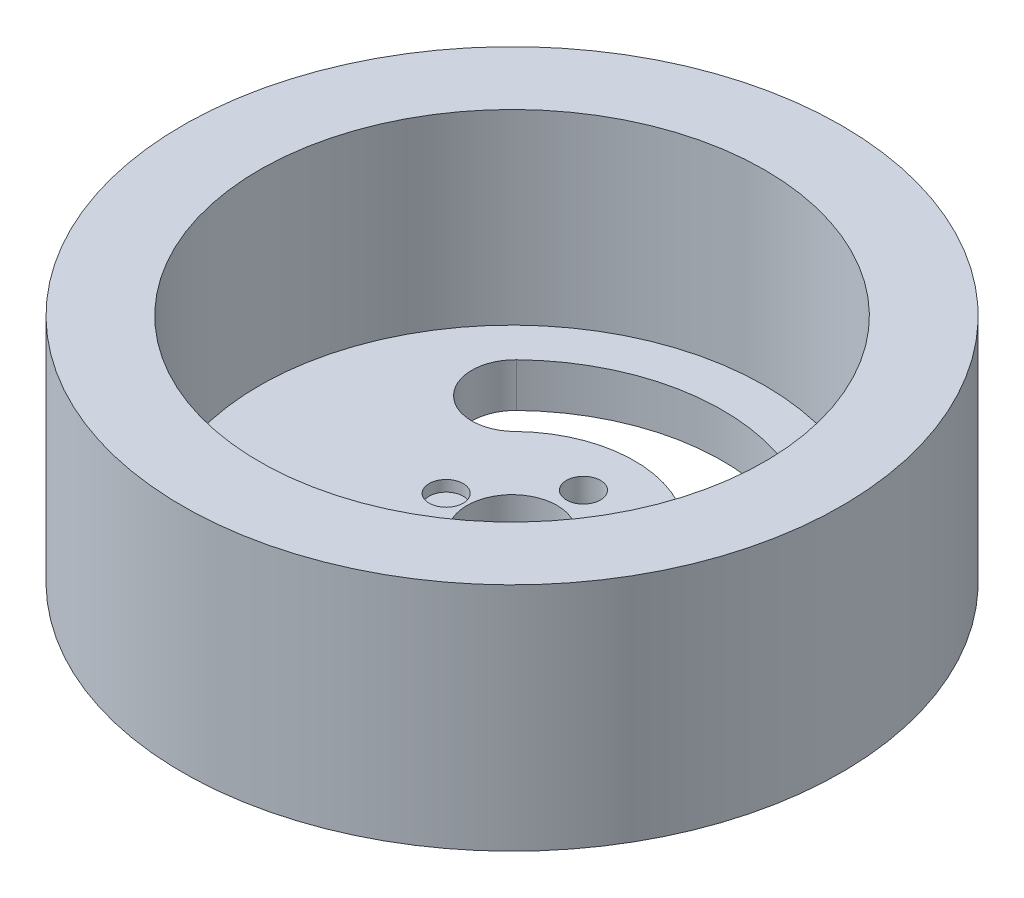
ISO-10303-21;
HEADER;
FILE_DESCRIPTION(('STEP AP214'),'2;1');
FILE_NAME('part.step','',(''),(''),'','','');
FILE_SCHEMA(('AUTOMOTIVE_DESIGN { 1 0 10303 214 1 1 1 1 }'));
ENDSEC;
DATA;
#1=APPLICATION_CONTEXT('core data for automotive mechanical design processes');
#2=APPLICATION_PROTOCOL_DEFINITION('international standard','automotive_design',2000,#1);
#3=PRODUCT_CONTEXT('',#1,'mechanical');
#4=PRODUCT('Part','Part','',(#3));
#5=PRODUCT_RELATED_PRODUCT_CATEGORY('part','',(#4));
#6=PRODUCT_DEFINITION_FORMATION('','',#4);
#7=PRODUCT_DEFINITION_CONTEXT('part definition',#1,'design');
#8=PRODUCT_DEFINITION('design','',#6,#7);
#9=PRODUCT_DEFINITION_SHAPE('','',#8);
#10=(LENGTH_UNIT() NAMED_UNIT(*) SI_UNIT(.MILLI.,.METRE.));
#11=(NAMED_UNIT(*) PLANE_ANGLE_UNIT() SI_UNIT($,.RADIAN.));
#12=(NAMED_UNIT(*) SI_UNIT($,.STERADIAN.) SOLID_ANGLE_UNIT());
#13=UNCERTAINTY_MEASURE_WITH_UNIT(LENGTH_MEASURE(1.E-05),#10,'distance_accuracy_value','');
#14=(GEOMETRIC_REPRESENTATION_CONTEXT(3) GLOBAL_UNCERTAINTY_ASSIGNED_CONTEXT((#13)) GLOBAL_UNIT_ASSIGNED_CONTEXT((#10,
#11,#12)) REPRESENTATION_CONTEXT('',''));
#15=CARTESIAN_POINT('',(0.,0.,0.));
#16=DIRECTION('',(0.,0.,1.));
#17=DIRECTION('',(1.,0.,0.));
#18=AXIS2_PLACEMENT_3D('',#15,#16,#17);
#19=CARTESIAN_POINT('',(0.,21.,0.));
#20=DIRECTION('',(0.,-1.,0.));
#21=DIRECTION('',(0.,0.,-1.));
#22=AXIS2_PLACEMENT_3D('',#19,#20,#21);
#23=CYLINDRICAL_SURFACE('',#22,23.);
#24=CARTESIAN_POINT('',(0.,1.,0.));
#25=DIRECTION('',(0.,-1.,0.));
#26=DIRECTION('',(0.,0.,-1.));
#27=AXIS2_PLACEMENT_3D('',#24,#25,#26);
#28=CIRCLE('',#27,23.);
#29=CARTESIAN_POINT('',(0.,1.,-23.));
#30=VERTEX_POINT('',#29);
#31=EDGE_CURVE('E11',#30,#30,#28,.T.);
#32=CARTESIAN_POINT('',(0.,18.,0.));
#33=DIRECTION('',(0.,1.,0.));
#34=DIRECTION('',(0.,0.,1.));
#35=AXIS2_PLACEMENT_3D('',#32,#33,#34);
#36=CIRCLE('',#35,23.);
#37=CARTESIAN_POINT('',(0.,18.,-23.));
#38=VERTEX_POINT('',#37);
#39=EDGE_CURVE('E121',#38,#38,#36,.T.);
#40=CARTESIAN_POINT('',(0.,1.,-23.));
#41=CARTESIAN_POINT('',(0.,1.17708333333333,-23.));
#42=CARTESIAN_POINT('',(0.,1.35416666666667,-23.));
#43=CARTESIAN_POINT('',(0.,1.70833333333333,-23.));
#44=CARTESIAN_POINT('',(0.,1.88541666666667,-23.));
#45=CARTESIAN_POINT('',(0.,2.23958333333334,-23.));
#46=CARTESIAN_POINT('',(0.,2.41666666666667,-23.));
#47=CARTESIAN_POINT('',(0.,2.77083333333334,-23.));
#48=CARTESIAN_POINT('',(0.,2.94791666666667,-23.));
#49=CARTESIAN_POINT('',(0.,3.30208333333334,-23.));
#50=CARTESIAN_POINT('',(0.,3.47916666666667,-23.));
#51=CARTESIAN_POINT('',(0.,3.83333333333333,-23.));
#52=CARTESIAN_POINT('',(0.,4.01041666666667,-23.));
#53=CARTESIAN_POINT('',(0.,4.36458333333333,-23.));
#54=CARTESIAN_POINT('',(0.,4.54166666666667,-23.));
#55=CARTESIAN_POINT('',(0.,4.89583333333333,-23.));
#56=CARTESIAN_POINT('',(0.,5.07291666666667,-23.));
#57=CARTESIAN_POINT('',(0.,5.42708333333333,-23.));
#58=CARTESIAN_POINT('',(0.,5.60416666666667,-23.));
#59=CARTESIAN_POINT('',(0.,5.95833333333333,-23.));
#60=CARTESIAN_POINT('',(0.,6.13541666666667,-23.));
#61=CARTESIAN_POINT('',(0.,6.48958333333333,-23.));
#62=CARTESIAN_POINT('',(0.,6.66666666666667,-23.));
#63=CARTESIAN_POINT('',(0.,7.02083333333333,-23.));
#64=CARTESIAN_POINT('',(0.,7.19791666666667,-23.));
#65=CARTESIAN_POINT('',(0.,7.55208333333333,-23.));
#66=CARTESIAN_POINT('',(0.,7.72916666666667,-23.));
#67=CARTESIAN_POINT('',(0.,8.08333333333333,-23.));
#68=CARTESIAN_POINT('',(0.,8.26041666666667,-23.));
#69=CARTESIAN_POINT('',(0.,8.61458333333333,-23.));
#70=CARTESIAN_POINT('',(0.,8.79166666666667,-23.));
#71=CARTESIAN_POINT('',(0.,9.14583333333333,-23.));
#72=CARTESIAN_POINT('',(0.,9.32291666666667,-23.));
#73=CARTESIAN_POINT('',(0.,9.67708333333333,-23.));
#74=CARTESIAN_POINT('',(0.,9.85416666666667,-23.));
#75=CARTESIAN_POINT('',(0.,10.2083333333333,-23.));
#76=CARTESIAN_POINT('',(0.,10.3854166666667,-23.));
#77=CARTESIAN_POINT('',(0.,10.7395833333333,-23.));
#78=CARTESIAN_POINT('',(0.,10.9166666666667,-23.));
#79=CARTESIAN_POINT('',(0.,11.2708333333333,-23.));
#80=CARTESIAN_POINT('',(0.,11.4479166666667,-23.));
#81=CARTESIAN_POINT('',(0.,11.8020833333333,-23.));
#82=CARTESIAN_POINT('',(0.,11.9791666666667,-23.));
#83=CARTESIAN_POINT('',(0.,12.3333333333333,-23.));
#84=CARTESIAN_POINT('',(0.,12.5104166666667,-23.));
#85=CARTESIAN_POINT('',(0.,12.8645833333333,-23.));
#86=CARTESIAN_POINT('',(0.,13.0416666666667,-23.));
#87=CARTESIAN_POINT('',(0.,13.3958333333333,-23.));
#88=CARTESIAN_POINT('',(0.,13.5729166666667,-23.));
#89=CARTESIAN_POINT('',(0.,13.9270833333333,-23.));
#90=CARTESIAN_POINT('',(0.,14.1041666666667,-23.));
#91=CARTESIAN_POINT('',(0.,14.4583333333333,-23.));
#92=CARTESIAN_POINT('',(0.,14.6354166666667,-23.));
#93=CARTESIAN_POINT('',(0.,14.9895833333333,-23.));
#94=CARTESIAN_POINT('',(0.,15.1666666666667,-23.));
#95=CARTESIAN_POINT('',(0.,15.5208333333333,-23.));
#96=CARTESIAN_POINT('',(0.,15.6979166666667,-23.));
#97=CARTESIAN_POINT('',(0.,16.0520833333333,-23.));
#98=CARTESIAN_POINT('',(0.,16.2291666666667,-23.));
#99=CARTESIAN_POINT('',(0.,16.5833333333333,-23.));
#100=CARTESIAN_POINT('',(0.,16.7604166666667,-23.));
#101=CARTESIAN_POINT('',(0.,17.1145833333333,-23.));
#102=CARTESIAN_POINT('',(0.,17.2916666666667,-23.));
#103=CARTESIAN_POINT('',(0.,17.6458333333333,-23.));
#104=CARTESIAN_POINT('',(0.,17.8229166666667,-23.));
#105=CARTESIAN_POINT('',(0.,18.,-23.));
#106=B_SPLINE_CURVE_WITH_KNOTS('',3,(#40,#41,#42,#43,#44,#45,#46,#47,#48,#49,#50,#51,#52,#53,
#54,#55,#56,#57,#58,#59,#60,#61,#62,#63,#64,#65,#66,#67,#68,#69,#70,#71,#72,#73,#74,#75,#76,#77,
#78,#79,#80,#81,#82,#83,#84,#85,#86,#87,#88,#89,#90,#91,#92,#93,#94,#95,#96,#97,#98,#99,#100,
#101,#102,#103,#104,#105),.UNSPECIFIED.,.F.,.F.,(4,2,2,2,2,2,2,2,2,2,2,2,2,2,2,2,2,2,2,2,2,2,2,
2,2,2,2,2,2,2,2,2,4),(0.,0.53125,1.0625,1.59375,2.125,2.65625,3.1875,3.71875,4.25,4.78125,
5.3125,5.84375,6.375,6.90625,7.4375,7.96875,8.5,9.03125,9.5625,10.09375,10.625,11.15625,11.6875,
12.21875,12.75,13.28125,13.8125,14.34375,14.875,15.40625,15.9375,16.46875,17.),.UNSPECIFIED.);
#107=EDGE_CURVE('BSEAM38',#30,#38,#106,.T.);
#108=ORIENTED_EDGE('',*,*,#31,.T.);
#109=ORIENTED_EDGE('',*,*,#39,.T.);
#110=ORIENTED_EDGE('',*,*,#107,.T.);
#111=ORIENTED_EDGE('',*,*,#107,.F.);
#112=EDGE_LOOP('',(#108,#110,#109,#111));
#113=FACE_BOUND('',#112,.T.);
#114=ADVANCED_FACE('F38',(#113),#23,.F.);
#115=CARTESIAN_POINT('',(0.,21.,0.));
#116=DIRECTION('',(0.,-1.,0.));
#117=DIRECTION('',(0.,0.,-1.));
#118=AXIS2_PLACEMENT_3D('',#115,#116,#117);
#119=CYLINDRICAL_SURFACE('',#118,30.);
#120=CARTESIAN_POINT('',(0.,-3.,0.));
#121=DIRECTION('',(0.,-1.,0.));
#122=DIRECTION('',(0.,0.,-1.));
#123=AXIS2_PLACEMENT_3D('',#120,#121,#122);
#124=CIRCLE('',#123,30.);
#125=CARTESIAN_POINT('',(0.,-3.,-30.));
#126=VERTEX_POINT('',#125);
#127=EDGE_CURVE('E156',#126,#126,#124,.T.);
#128=CARTESIAN_POINT('',(0.,18.,0.));
#129=DIRECTION('',(0.,1.,0.));
#130=DIRECTION('',(0.,0.,1.));
#131=AXIS2_PLACEMENT_3D('',#128,#129,#130);
#132=CIRCLE('',#131,30.);
#133=CARTESIAN_POINT('',(0.,18.,-30.));
#134=VERTEX_POINT('',#133);
#135=EDGE_CURVE('E221',#134,#134,#132,.T.);
#136=CARTESIAN_POINT('',(0.,-3.,-30.));
#137=CARTESIAN_POINT('',(0.,-2.78125,-30.));
#138=CARTESIAN_POINT('',(0.,-2.5625,-30.));
#139=CARTESIAN_POINT('',(0.,-2.125,-30.));
#140=CARTESIAN_POINT('',(0.,-1.90625,-30.));
#141=CARTESIAN_POINT('',(0.,-1.46875,-30.));
#142=CARTESIAN_POINT('',(0.,-1.25,-30.));
#143=CARTESIAN_POINT('',(0.,-0.812500000000001,-30.));
#144=CARTESIAN_POINT('',(0.,-0.593750000000001,-30.));
#145=CARTESIAN_POINT('',(0.,-0.156250000000001,-30.));
#146=CARTESIAN_POINT('',(0.,0.0624999999999977,-30.));
#147=CARTESIAN_POINT('',(0.,0.499999999999997,-30.));
#148=CARTESIAN_POINT('',(0.,0.718749999999997,-30.));
#149=CARTESIAN_POINT('',(0.,1.15625,-30.));
#150=CARTESIAN_POINT('',(0.,1.375,-30.));
#151=CARTESIAN_POINT('',(0.,1.8125,-30.));
#152=CARTESIAN_POINT('',(0.,2.03125,-30.));
#153=CARTESIAN_POINT('',(0.,2.46875,-30.));
#154=CARTESIAN_POINT('',(0.,2.6875,-30.));
#155=CARTESIAN_POINT('',(0.,3.125,-30.));
#156=CARTESIAN_POINT('',(0.,3.34375,-30.));
#157=CARTESIAN_POINT('',(0.,3.78125,-30.));
#158=CARTESIAN_POINT('',(0.,4.,-30.));
#159=CARTESIAN_POINT('',(0.,4.4375,-30.));
#160=CARTESIAN_POINT('',(0.,4.65625,-30.));
#161=CARTESIAN_POINT('',(0.,5.09375,-30.));
#162=CARTESIAN_POINT('',(0.,5.3125,-30.));
#163=CARTESIAN_POINT('',(0.,5.75,-30.));
#164=CARTESIAN_POINT('',(0.,5.96875,-30.));
#165=CARTESIAN_POINT('',(0.,6.40625,-30.));
#166=CARTESIAN_POINT('',(0.,6.625,-30.));
#167=CARTESIAN_POINT('',(0.,7.0625,-30.));
#168=CARTESIAN_POINT('',(0.,7.28125,-30.));
#169=CARTESIAN_POINT('',(0.,7.71875,-30.));
#170=CARTESIAN_POINT('',(0.,7.9375,-30.));
#171=CARTESIAN_POINT('',(0.,8.375,-30.));
#172=CARTESIAN_POINT('',(0.,8.59375,-30.));
#173=CARTESIAN_POINT('',(0.,9.03125,-30.));
#174=CARTESIAN_POINT('',(0.,9.25,-30.));
#175=CARTESIAN_POINT('',(0.,9.6875,-30.));
#176=CARTESIAN_POINT('',(0.,9.90625,-30.));
#177=CARTESIAN_POINT('',(0.,10.34375,-30.));
#178=CARTESIAN_POINT('',(0.,10.5625,-30.));
#179=CARTESIAN_POINT('',(0.,11.,-30.));
#180=CARTESIAN_POINT('',(0.,11.21875,-30.));
#181=CARTESIAN_POINT('',(0.,11.65625,-30.));
#182=CARTESIAN_POINT('',(0.,11.875,-30.));
#183=CARTESIAN_POINT('',(0.,12.3125,-30.));
#184=CARTESIAN_POINT('',(0.,12.53125,-30.));
#185=CARTESIAN_POINT('',(0.,12.96875,-30.));
#186=CARTESIAN_POINT('',(0.,13.1875,-30.));
#187=CARTESIAN_POINT('',(0.,13.625,-30.));
#188=CARTESIAN_POINT('',(0.,13.84375,-30.));
#189=CARTESIAN_POINT('',(0.,14.28125,-30.));
#190=CARTESIAN_POINT('',(0.,14.5,-30.));
#191=CARTESIAN_POINT('',(0.,14.9375,-30.));
#192=CARTESIAN_POINT('',(0.,15.15625,-30.));
#193=CARTESIAN_POINT('',(0.,15.59375,-30.));
#194=CARTESIAN_POINT('',(0.,15.8125,-30.));
#195=CARTESIAN_POINT('',(0.,16.25,-30.));
#196=CARTESIAN_POINT('',(0.,16.46875,-30.));
#197=CARTESIAN_POINT('',(0.,16.90625,-30.));
#198=CARTESIAN_POINT('',(0.,17.125,-30.));
#199=CARTESIAN_POINT('',(0.,17.5625,-30.));
#200=CARTESIAN_POINT('',(0.,17.78125,-30.));
#201=CARTESIAN_POINT('',(0.,18.,-30.));
#202=B_SPLINE_CURVE_WITH_KNOTS('',3,(#136,#137,#138,#139,#140,#141,#142,#143,#144,#145,#146,
#147,#148,#149,#150,#151,#152,#153,#154,#155,#156,#157,#158,#159,#160,#161,#162,#163,#164,#165,
#166,#167,#168,#169,#170,#171,#172,#173,#174,#175,#176,#177,#178,#179,#180,#181,#182,#183,#184,
#185,#186,#187,#188,#189,#190,#191,#192,#193,#194,#195,#196,#197,#198,#199,#200,#201),
.UNSPECIFIED.,.F.,.F.,(4,2,2,2,2,2,2,2,2,2,2,2,2,2,2,2,2,2,2,2,2,2,2,2,2,2,2,2,2,2,2,2,4),(0.,
0.656250000000001,1.3125,1.96875,2.625,3.28125,3.9375,4.59375,5.25,5.90625,6.5625,7.21875,7.875,
8.53125,9.1875,9.84375,10.5,11.15625,11.8125,12.46875,13.125,13.78125,14.4375,15.09375,15.75,
16.40625,17.0625,17.71875,18.375,19.03125,19.6875,20.34375,21.),.UNSPECIFIED.);
#203=EDGE_CURVE('BSEAM40',#126,#134,#202,.T.);
#204=ORIENTED_EDGE('',*,*,#127,.F.);
#205=ORIENTED_EDGE('',*,*,#135,.F.);
#206=ORIENTED_EDGE('',*,*,#203,.T.);
#207=ORIENTED_EDGE('',*,*,#203,.F.);
#208=EDGE_LOOP('',(#204,#206,#205,#207));
#209=FACE_BOUND('',#208,.T.);
#210=ADVANCED_FACE('F40',(#209),#119,.T.);
#211=CARTESIAN_POINT('',(0.,1.,0.));
#212=DIRECTION('',(0.,-1.,0.));
#213=DIRECTION('',(0.,0.,-1.));
#214=AXIS2_PLACEMENT_3D('',#211,#212,#213);
#215=PLANE('',#214);
#216=CARTESIAN_POINT('',(0.,1.,-6.5));
#217=DIRECTION('',(0.,-1.,0.));
#218=DIRECTION('',(0.,0.,-1.));
#219=AXIS2_PLACEMENT_3D('',#216,#217,#218);
#220=CIRCLE('',#219,1.55);
#221=CARTESIAN_POINT('',(0.,1.,-8.05));
#222=VERTEX_POINT('',#221);
#223=EDGE_CURVE('E160',#222,#222,#220,.T.);
#224=ORIENTED_EDGE('',*,*,#223,.T.);
#225=EDGE_LOOP('',(#224));
#226=FACE_BOUND('',#225,.T.);
#227=CARTESIAN_POINT('',(0.,1.,6.5));
#228=DIRECTION('',(0.,-1.,0.));
#229=DIRECTION('',(0.,0.,-1.));
#230=AXIS2_PLACEMENT_3D('',#227,#228,#229);
#231=CIRCLE('',#230,1.55);
#232=CARTESIAN_POINT('',(0.,1.,4.95));
#233=VERTEX_POINT('',#232);
#234=EDGE_CURVE('E163',#233,#233,#231,.T.);
#235=ORIENTED_EDGE('',*,*,#234,.T.);
#236=EDGE_LOOP('',(#235));
#237=FACE_BOUND('',#236,.T.);
#238=CARTESIAN_POINT('',(-6.,1.,0.));
#239=DIRECTION('',(0.,-1.,0.));
#240=DIRECTION('',(0.,0.,-1.));
#241=AXIS2_PLACEMENT_3D('',#238,#239,#240);
#242=CIRCLE('',#241,1.55);
#243=CARTESIAN_POINT('',(-6.,1.,-1.55));
#244=VERTEX_POINT('',#243);
#245=EDGE_CURVE('E166',#244,#244,#242,.T.);
#246=ORIENTED_EDGE('',*,*,#245,.T.);
#247=EDGE_LOOP('',(#246));
#248=FACE_BOUND('',#247,.T.);
#249=CARTESIAN_POINT('',(6.,1.,0.));
#250=DIRECTION('',(0.,-1.,0.));
#251=DIRECTION('',(0.,0.,-1.));
#252=AXIS2_PLACEMENT_3D('',#249,#250,#251);
#253=CIRCLE('',#252,1.55);
#254=CARTESIAN_POINT('',(6.,1.,-1.55));
#255=VERTEX_POINT('',#254);
#256=EDGE_CURVE('E169',#255,#255,#253,.T.);
#257=ORIENTED_EDGE('',*,*,#256,.T.);
#258=EDGE_LOOP('',(#257));
#259=FACE_BOUND('',#258,.T.);
#260=CARTESIAN_POINT('',(0.,1.,0.));
#261=DIRECTION('',(0.,-1.,0.));
#262=DIRECTION('',(0.,0.,-1.));
#263=AXIS2_PLACEMENT_3D('',#260,#261,#262);
#264=CIRCLE('',#263,4.1);
#265=CARTESIAN_POINT('',(0.,1.,-4.1));
#266=VERTEX_POINT('',#265);
#267=EDGE_CURVE('E174',#266,#266,#264,.T.);
#268=ORIENTED_EDGE('',*,*,#267,.T.);
#269=EDGE_LOOP('',(#268));
#270=FACE_BOUND('',#269,.T.);
#271=CARTESIAN_POINT('',(0.,1.,0.));
#272=DIRECTION('',(0.,-1.,0.));
#273=DIRECTION('',(0.,0.,1.));
#274=AXIS2_PLACEMENT_3D('',#271,#272,#273);
#275=CIRCLE('',#274,19.1434235402803);
#276=CARTESIAN_POINT('',(-13.3249758751776,1.,-13.7446601547108));
#277=VERTEX_POINT('',#276);
#278=CARTESIAN_POINT('',(13.7446601547108,1.,-13.3249758751776));
#279=VERTEX_POINT('',#278);
#280=EDGE_CURVE('E184',#277,#279,#275,.T.);
#281=ORIENTED_EDGE('',*,*,#280,.T.);
#282=CARTESIAN_POINT('',(10.8727265894757,1.,-10.5407349378886));
#283=DIRECTION('',(0.,-1.,0.));
#284=DIRECTION('',(0.,0.,1.));
#285=AXIS2_PLACEMENT_3D('',#282,#283,#284);
#286=CIRCLE('',#285,4.);
#287=CARTESIAN_POINT('',(8.00079302424056,1.,-7.75649400059958));
#288=VERTEX_POINT('',#287);
#289=EDGE_CURVE('E177',#279,#288,#286,.T.);
#290=ORIENTED_EDGE('',*,*,#289,.T.);
#291=CARTESIAN_POINT('',(0.,1.,0.));
#292=DIRECTION('',(0.,1.,0.));
#293=DIRECTION('',(0.,0.,1.));
#294=AXIS2_PLACEMENT_3D('',#291,#292,#293);
#295=CIRCLE('',#294,11.1434235402803);
#296=CARTESIAN_POINT('',(-7.75649400059958,1.,-8.00079302424056));
#297=VERTEX_POINT('',#296);
#298=EDGE_CURVE('E180',#288,#297,#295,.T.);
#299=ORIENTED_EDGE('',*,*,#298,.T.);
#300=CARTESIAN_POINT('',(-10.5407349378886,1.,-10.8727265894757));
#301=DIRECTION('',(0.,-1.,0.));
#302=DIRECTION('',(0.,0.,1.));
#303=AXIS2_PLACEMENT_3D('',#300,#301,#302);
#304=CIRCLE('',#303,4.);
#305=EDGE_CURVE('E53',#297,#277,#304,.T.);
#306=ORIENTED_EDGE('',*,*,#305,.T.);
#307=EDGE_LOOP('',(#281,#290,#299,#306));
#308=FACE_BOUND('',#307,.T.);
#309=CARTESIAN_POINT('',(0.,1.,0.));
#310=DIRECTION('',(0.,1.,0.));
#311=DIRECTION('',(0.,0.,-1.));
#312=AXIS2_PLACEMENT_3D('',#309,#310,#311);
#313=CIRCLE('',#312,11.1434235402803);
#314=CARTESIAN_POINT('',(-7.75649400059958,1.,8.00079302424056));
#315=VERTEX_POINT('',#314);
#316=CARTESIAN_POINT('',(8.00079302424056,1.,7.75649400059958));
#317=VERTEX_POINT('',#316);
#318=EDGE_CURVE('E200',#315,#317,#313,.T.);
#319=ORIENTED_EDGE('',*,*,#318,.T.);
#320=CARTESIAN_POINT('',(10.8727265894757,1.,10.5407349378886));
#321=DIRECTION('',(0.,-1.,0.));
#322=DIRECTION('',(0.,0.,-1.));
#323=AXIS2_PLACEMENT_3D('',#320,#321,#322);
#324=CIRCLE('',#323,4.);
#325=CARTESIAN_POINT('',(13.7446601547108,1.,13.3249758751776));
#326=VERTEX_POINT('',#325);
#327=EDGE_CURVE('E109',#317,#326,#324,.T.);
#328=ORIENTED_EDGE('',*,*,#327,.T.);
#329=CARTESIAN_POINT('',(0.,1.,0.));
#330=DIRECTION('',(0.,-1.,0.));
#331=DIRECTION('',(0.,0.,-1.));
#332=AXIS2_PLACEMENT_3D('',#329,#330,#331);
#333=CIRCLE('',#332,19.1434235402803);
#334=CARTESIAN_POINT('',(-13.3249758751776,1.,13.7446601547108));
#335=VERTEX_POINT('',#334);
#336=EDGE_CURVE('E196',#326,#335,#333,.T.);
#337=ORIENTED_EDGE('',*,*,#336,.T.);
#338=CARTESIAN_POINT('',(-10.5407349378886,1.,10.8727265894757));
#339=DIRECTION('',(0.,-1.,0.));
#340=DIRECTION('',(0.,0.,-1.));
#341=AXIS2_PLACEMENT_3D('',#338,#339,#340);
#342=CIRCLE('',#341,4.);
#343=EDGE_CURVE('E61',#335,#315,#342,.T.);
#344=ORIENTED_EDGE('',*,*,#343,.T.);
#345=EDGE_LOOP('',(#319,#328,#337,#344));
#346=FACE_BOUND('',#345,.T.);
#347=ORIENTED_EDGE('',*,*,#31,.F.);
#348=EDGE_LOOP('',(#347));
#349=FACE_BOUND('',#348,.T.);
#350=ADVANCED_FACE('F209',(#226,#237,#248,#259,#270,#308,#346,#349),#215,.F.);
#351=CARTESIAN_POINT('',(10.8727265894757,1.,10.5407349378886));
#352=DIRECTION('',(0.,-1.,0.));
#353=DIRECTION('',(0.,0.,-1.));
#354=AXIS2_PLACEMENT_3D('',#351,#352,#353);
#355=CYLINDRICAL_SURFACE('',#354,4.);
#356=DIRECTION('',(0.,-1.,0.));
#357=VECTOR('',#356,1.);
#358=CARTESIAN_POINT('',(8.00079302424056,1.,7.75649400059958));
#359=LINE('',#358,#357);
#360=CARTESIAN_POINT('',(8.00079302424056,-3.,7.75649400059958));
#361=VERTEX_POINT('',#360);
#362=EDGE_CURVE('E46',#317,#361,#359,.T.);
#363=ORIENTED_EDGE('',*,*,#362,.T.);
#364=CARTESIAN_POINT('',(10.8727265894757,-3.,10.5407349378886));
#365=DIRECTION('',(0.,-1.,0.));
#366=DIRECTION('',(0.,0.,-1.));
#367=AXIS2_PLACEMENT_3D('',#364,#365,#366);
#368=CIRCLE('',#367,4.);
#369=CARTESIAN_POINT('',(13.7446601547108,-3.,13.3249758751776));
#370=VERTEX_POINT('',#369);
#371=EDGE_CURVE('E106',#361,#370,#368,.T.);
#372=ORIENTED_EDGE('',*,*,#371,.T.);
#373=DIRECTION('',(0.,-1.,0.));
#374=VECTOR('',#373,1.);
#375=CARTESIAN_POINT('',(13.7446601547108,1.,13.3249758751776));
#376=LINE('',#375,#374);
#377=EDGE_CURVE('E201',#326,#370,#376,.T.);
#378=ORIENTED_EDGE('',*,*,#377,.F.);
#379=ORIENTED_EDGE('',*,*,#327,.F.);
#380=EDGE_LOOP('',(#363,#372,#378,#379));
#381=FACE_BOUND('',#380,.T.);
#382=ADVANCED_FACE('F104',(#381),#355,.F.);
#383=CARTESIAN_POINT('',(0.,1.,0.));
#384=DIRECTION('',(0.,-1.,0.));
#385=DIRECTION('',(0.,0.,-1.));
#386=AXIS2_PLACEMENT_3D('',#383,#384,#385);
#387=CYLINDRICAL_SURFACE('',#386,11.1434235402803);
#388=DIRECTION('',(0.,-1.,0.));
#389=VECTOR('',#388,1.);
#390=CARTESIAN_POINT('',(-7.75649400059958,1.,8.00079302424056));
#391=LINE('',#390,#389);
#392=CARTESIAN_POINT('',(-7.75649400059958,-3.,8.00079302424056));
#393=VERTEX_POINT('',#392);
#394=EDGE_CURVE('E113',#315,#393,#391,.T.);
#395=ORIENTED_EDGE('',*,*,#394,.T.);
#396=CARTESIAN_POINT('',(0.,-3.,0.));
#397=DIRECTION('',(0.,1.,0.));
#398=DIRECTION('',(0.,0.,-1.));
#399=AXIS2_PLACEMENT_3D('',#396,#397,#398);
#400=CIRCLE('',#399,11.1434235402803);
#401=EDGE_CURVE('E116',#393,#361,#400,.T.);
#402=ORIENTED_EDGE('',*,*,#401,.T.);
#403=ORIENTED_EDGE('',*,*,#362,.F.);
#404=ORIENTED_EDGE('',*,*,#318,.F.);
#405=EDGE_LOOP('',(#395,#402,#403,#404));
#406=FACE_BOUND('',#405,.T.);
#407=ADVANCED_FACE('F117',(#406),#387,.T.);
#408=CARTESIAN_POINT('',(-10.5407349378886,1.,10.8727265894757));
#409=DIRECTION('',(0.,-1.,0.));
#410=DIRECTION('',(0.,0.,-1.));
#411=AXIS2_PLACEMENT_3D('',#408,#409,#410);
#412=CYLINDRICAL_SURFACE('',#411,4.);
#413=DIRECTION('',(0.,-1.,0.));
#414=VECTOR('',#413,1.);
#415=CARTESIAN_POINT('',(-13.3249758751776,1.,13.7446601547108));
#416=LINE('',#415,#414);
#417=CARTESIAN_POINT('',(-13.3249758751776,-3.,13.7446601547108));
#418=VERTEX_POINT('',#417);
#419=EDGE_CURVE('E204',#335,#418,#416,.T.);
#420=ORIENTED_EDGE('',*,*,#419,.T.);
#421=CARTESIAN_POINT('',(-10.5407349378886,-3.,10.8727265894757));
#422=DIRECTION('',(0.,-1.,0.));
#423=DIRECTION('',(0.,0.,-1.));
#424=AXIS2_PLACEMENT_3D('',#421,#422,#423);
#425=CIRCLE('',#424,4.);
#426=EDGE_CURVE('E127',#418,#393,#425,.T.);
#427=ORIENTED_EDGE('',*,*,#426,.T.);
#428=ORIENTED_EDGE('',*,*,#394,.F.);
#429=ORIENTED_EDGE('',*,*,#343,.F.);
#430=EDGE_LOOP('',(#420,#427,#428,#429));
#431=FACE_BOUND('',#430,.T.);
#432=ADVANCED_FACE('F289',(#431),#412,.F.);
#433=CARTESIAN_POINT('',(0.,1.,0.));
#434=DIRECTION('',(0.,-1.,0.));
#435=DIRECTION('',(0.,0.,-1.));
#436=AXIS2_PLACEMENT_3D('',#433,#434,#435);
#437=CYLINDRICAL_SURFACE('',#436,19.1434235402803);
#438=ORIENTED_EDGE('',*,*,#377,.T.);
#439=CARTESIAN_POINT('',(0.,-3.,0.));
#440=DIRECTION('',(0.,-1.,0.));
#441=DIRECTION('',(0.,0.,-1.));
#442=AXIS2_PLACEMENT_3D('',#439,#440,#441);
#443=CIRCLE('',#442,19.1434235402803);
#444=EDGE_CURVE('E125',#370,#418,#443,.T.);
#445=ORIENTED_EDGE('',*,*,#444,.T.);
#446=ORIENTED_EDGE('',*,*,#419,.F.);
#447=ORIENTED_EDGE('',*,*,#336,.F.);
#448=EDGE_LOOP('',(#438,#445,#446,#447));
#449=FACE_BOUND('',#448,.T.);
#450=ADVANCED_FACE('F207',(#449),#437,.F.);
#451=CARTESIAN_POINT('',(10.8727265894757,1.,-10.5407349378886));
#452=DIRECTION('',(0.,-1.,0.));
#453=DIRECTION('',(0.,0.,-1.));
#454=AXIS2_PLACEMENT_3D('',#451,#452,#453);
#455=CYLINDRICAL_SURFACE('',#454,4.);
#456=DIRECTION('',(0.,-1.,0.));
#457=VECTOR('',#456,1.);
#458=CARTESIAN_POINT('',(13.7446601547108,1.,-13.3249758751776));
#459=LINE('',#458,#457);
#460=CARTESIAN_POINT('',(13.7446601547108,-3.,-13.3249758751776));
#461=VERTEX_POINT('',#460);
#462=EDGE_CURVE('E188',#279,#461,#459,.T.);
#463=ORIENTED_EDGE('',*,*,#462,.T.);
#464=CARTESIAN_POINT('',(10.8727265894757,-3.,-10.5407349378886));
#465=DIRECTION('',(0.,-1.,0.));
#466=DIRECTION('',(0.,0.,-1.));
#467=AXIS2_PLACEMENT_3D('',#464,#465,#466);
#468=CIRCLE('',#467,4.);
#469=CARTESIAN_POINT('',(8.00079302424056,-3.,-7.75649400059958));
#470=VERTEX_POINT('',#469);
#471=EDGE_CURVE('E153',#461,#470,#468,.T.);
#472=ORIENTED_EDGE('',*,*,#471,.T.);
#473=DIRECTION('',(0.,-1.,0.));
#474=VECTOR('',#473,1.);
#475=CARTESIAN_POINT('',(8.00079302424056,1.,-7.75649400059958));
#476=LINE('',#475,#474);
#477=EDGE_CURVE('E187',#288,#470,#476,.T.);
#478=ORIENTED_EDGE('',*,*,#477,.F.);
#479=ORIENTED_EDGE('',*,*,#289,.F.);
#480=EDGE_LOOP('',(#463,#472,#478,#479));
#481=FACE_BOUND('',#480,.T.);
#482=ADVANCED_FACE('F277',(#481),#455,.F.);
#483=CARTESIAN_POINT('',(0.,1.,0.));
#484=DIRECTION('',(0.,-1.,0.));
#485=DIRECTION('',(0.,0.,-1.));
#486=AXIS2_PLACEMENT_3D('',#483,#484,#485);
#487=CYLINDRICAL_SURFACE('',#486,19.1434235402803);
#488=DIRECTION('',(0.,-1.,0.));
#489=VECTOR('',#488,1.);
#490=CARTESIAN_POINT('',(-13.3249758751776,1.,-13.7446601547108));
#491=LINE('',#490,#489);
#492=CARTESIAN_POINT('',(-13.3249758751776,-3.,-13.7446601547108));
#493=VERTEX_POINT('',#492);
#494=EDGE_CURVE('E190',#277,#493,#491,.T.);
#495=ORIENTED_EDGE('',*,*,#494,.T.);
#496=CARTESIAN_POINT('',(0.,-3.,0.));
#497=DIRECTION('',(0.,-1.,0.));
#498=DIRECTION('',(0.,0.,-1.));
#499=AXIS2_PLACEMENT_3D('',#496,#497,#498);
#500=CIRCLE('',#499,19.1434235402803);
#501=EDGE_CURVE('E150',#493,#461,#500,.T.);
#502=ORIENTED_EDGE('',*,*,#501,.T.);
#503=ORIENTED_EDGE('',*,*,#462,.F.);
#504=ORIENTED_EDGE('',*,*,#280,.F.);
#505=EDGE_LOOP('',(#495,#502,#503,#504));
#506=FACE_BOUND('',#505,.T.);
#507=ADVANCED_FACE('F273',(#506),#487,.F.);
#508=CARTESIAN_POINT('',(-10.5407349378886,1.,-10.8727265894757));
#509=DIRECTION('',(0.,-1.,0.));
#510=DIRECTION('',(0.,0.,-1.));
#511=AXIS2_PLACEMENT_3D('',#508,#509,#510);
#512=CYLINDRICAL_SURFACE('',#511,4.);
#513=DIRECTION('',(0.,-1.,0.));
#514=VECTOR('',#513,1.);
#515=CARTESIAN_POINT('',(-7.75649400059958,1.,-8.00079302424056));
#516=LINE('',#515,#514);
#517=CARTESIAN_POINT('',(-7.75649400059958,-3.,-8.00079302424056));
#518=VERTEX_POINT('',#517);
#519=EDGE_CURVE('E192',#297,#518,#516,.T.);
#520=ORIENTED_EDGE('',*,*,#519,.T.);
#521=CARTESIAN_POINT('',(-10.5407349378886,-3.,-10.8727265894757));
#522=DIRECTION('',(0.,-1.,0.));
#523=DIRECTION('',(0.,0.,-1.));
#524=AXIS2_PLACEMENT_3D('',#521,#522,#523);
#525=CIRCLE('',#524,4.);
#526=EDGE_CURVE('E147',#518,#493,#525,.T.);
#527=ORIENTED_EDGE('',*,*,#526,.T.);
#528=ORIENTED_EDGE('',*,*,#494,.F.);
#529=ORIENTED_EDGE('',*,*,#305,.F.);
#530=EDGE_LOOP('',(#520,#527,#528,#529));
#531=FACE_BOUND('',#530,.T.);
#532=ADVANCED_FACE('F276',(#531),#512,.F.);
#533=CARTESIAN_POINT('',(0.,1.,0.));
#534=DIRECTION('',(0.,-1.,0.));
#535=DIRECTION('',(0.,0.,-1.));
#536=AXIS2_PLACEMENT_3D('',#533,#534,#535);
#537=CYLINDRICAL_SURFACE('',#536,11.1434235402803);
#538=ORIENTED_EDGE('',*,*,#477,.T.);
#539=CARTESIAN_POINT('',(0.,-3.,0.));
#540=DIRECTION('',(0.,1.,0.));
#541=DIRECTION('',(0.,0.,-1.));
#542=AXIS2_PLACEMENT_3D('',#539,#540,#541);
#543=CIRCLE('',#542,11.1434235402803);
#544=EDGE_CURVE('E144',#470,#518,#543,.T.);
#545=ORIENTED_EDGE('',*,*,#544,.T.);
#546=ORIENTED_EDGE('',*,*,#519,.F.);
#547=ORIENTED_EDGE('',*,*,#298,.F.);
#548=EDGE_LOOP('',(#538,#545,#546,#547));
#549=FACE_BOUND('',#548,.T.);
#550=ADVANCED_FACE('F271',(#549),#537,.T.);
#551=CARTESIAN_POINT('',(0.,1.,0.));
#552=DIRECTION('',(0.,-1.,0.));
#553=DIRECTION('',(0.,0.,-1.));
#554=AXIS2_PLACEMENT_3D('',#551,#552,#553);
#555=CYLINDRICAL_SURFACE('',#554,4.1);
#556=ORIENTED_EDGE('',*,*,#267,.F.);
#557=EDGE_LOOP('',(#556));
#558=FACE_BOUND('',#557,.T.);
#559=CARTESIAN_POINT('',(0.,-3.,0.));
#560=DIRECTION('',(0.,-1.,0.));
#561=DIRECTION('',(0.,0.,-1.));
#562=AXIS2_PLACEMENT_3D('',#559,#560,#561);
#563=CIRCLE('',#562,4.1);
#564=CARTESIAN_POINT('',(0.,-3.,-4.1));
#565=VERTEX_POINT('',#564);
#566=EDGE_CURVE('E135',#565,#565,#563,.T.);
#567=ORIENTED_EDGE('',*,*,#566,.T.);
#568=EDGE_LOOP('',(#567));
#569=FACE_BOUND('',#568,.T.);
#570=ADVANCED_FACE('F267',(#558,#569),#555,.F.);
#571=CARTESIAN_POINT('',(6.,1.,0.));
#572=DIRECTION('',(0.,-1.,0.));
#573=DIRECTION('',(0.,0.,-1.));
#574=AXIS2_PLACEMENT_3D('',#571,#572,#573);
#575=CYLINDRICAL_SURFACE('',#574,1.55);
#576=ORIENTED_EDGE('',*,*,#256,.F.);
#577=EDGE_LOOP('',(#576));
#578=FACE_BOUND('',#577,.T.);
#579=CARTESIAN_POINT('',(6.,-3.,0.));
#580=DIRECTION('',(0.,-1.,0.));
#581=DIRECTION('',(0.,0.,-1.));
#582=AXIS2_PLACEMENT_3D('',#579,#580,#581);
#583=CIRCLE('',#582,1.55);
#584=CARTESIAN_POINT('',(6.,-3.,-1.55));
#585=VERTEX_POINT('',#584);
#586=EDGE_CURVE('E138',#585,#585,#583,.T.);
#587=ORIENTED_EDGE('',*,*,#586,.T.);
#588=EDGE_LOOP('',(#587));
#589=FACE_BOUND('',#588,.T.);
#590=ADVANCED_FACE('F259',(#578,#589),#575,.F.);
#591=CARTESIAN_POINT('',(-6.,1.,0.));
#592=DIRECTION('',(0.,-1.,0.));
#593=DIRECTION('',(0.,0.,-1.));
#594=AXIS2_PLACEMENT_3D('',#591,#592,#593);
#595=CYLINDRICAL_SURFACE('',#594,1.55);
#596=ORIENTED_EDGE('',*,*,#245,.F.);
#597=EDGE_LOOP('',(#596));
#598=FACE_BOUND('',#597,.T.);
#599=CARTESIAN_POINT('',(-6.,0.,0.));
#600=DIRECTION('',(0.,-1.,0.));
#601=DIRECTION('',(0.,0.,-1.));
#602=AXIS2_PLACEMENT_3D('',#599,#600,#601);
#603=CIRCLE('',#602,1.55);
#604=CARTESIAN_POINT('',(-6.,0.,-1.55));
#605=VERTEX_POINT('',#604);
#606=EDGE_CURVE('E159',#605,#605,#603,.T.);
#607=ORIENTED_EDGE('',*,*,#606,.T.);
#608=EDGE_LOOP('',(#607));
#609=FACE_BOUND('',#608,.T.);
#610=ADVANCED_FACE('F250',(#598,#609),#595,.F.);
#611=CARTESIAN_POINT('',(0.,1.,6.5));
#612=DIRECTION('',(0.,-1.,0.));
#613=DIRECTION('',(0.,0.,-1.));
#614=AXIS2_PLACEMENT_3D('',#611,#612,#613);
#615=CYLINDRICAL_SURFACE('',#614,1.55);
#616=ORIENTED_EDGE('',*,*,#234,.F.);
#617=EDGE_LOOP('',(#616));
#618=FACE_BOUND('',#617,.T.);
#619=CARTESIAN_POINT('',(0.,-3.,6.5));
#620=DIRECTION('',(0.,-1.,0.));
#621=DIRECTION('',(0.,0.,-1.));
#622=AXIS2_PLACEMENT_3D('',#619,#620,#621);
#623=CIRCLE('',#622,1.55);
#624=CARTESIAN_POINT('',(0.,-3.,4.95));
#625=VERTEX_POINT('',#624);
#626=EDGE_CURVE('E132',#625,#625,#623,.T.);
#627=ORIENTED_EDGE('',*,*,#626,.T.);
#628=EDGE_LOOP('',(#627));
#629=FACE_BOUND('',#628,.T.);
#630=ADVANCED_FACE('F247',(#618,#629),#615,.F.);
#631=CARTESIAN_POINT('',(0.,1.,-6.5));
#632=DIRECTION('',(0.,-1.,0.));
#633=DIRECTION('',(0.,0.,-1.));
#634=AXIS2_PLACEMENT_3D('',#631,#632,#633);
#635=CYLINDRICAL_SURFACE('',#634,1.55);
#636=ORIENTED_EDGE('',*,*,#223,.F.);
#637=EDGE_LOOP('',(#636));
#638=FACE_BOUND('',#637,.T.);
#639=CARTESIAN_POINT('',(0.,-3.,-6.5));
#640=DIRECTION('',(0.,-1.,0.));
#641=DIRECTION('',(0.,0.,-1.));
#642=AXIS2_PLACEMENT_3D('',#639,#640,#641);
#643=CIRCLE('',#642,1.55);
#644=CARTESIAN_POINT('',(0.,-3.,-8.05));
#645=VERTEX_POINT('',#644);
#646=EDGE_CURVE('E141',#645,#645,#643,.T.);
#647=ORIENTED_EDGE('',*,*,#646,.T.);
#648=EDGE_LOOP('',(#647));
#649=FACE_BOUND('',#648,.T.);
#650=ADVANCED_FACE('F249',(#638,#649),#635,.F.);
#651=CARTESIAN_POINT('',(0.,0.,0.));
#652=DIRECTION('',(0.,-1.,0.));
#653=DIRECTION('',(0.,0.,-1.));
#654=AXIS2_PLACEMENT_3D('',#651,#652,#653);
#655=PLANE('',#654);
#656=ORIENTED_EDGE('',*,*,#606,.F.);
#657=EDGE_LOOP('',(#656));
#658=FACE_BOUND('',#657,.T.);
#659=ADVANCED_FACE('F236',(#658),#655,.F.);
#660=CARTESIAN_POINT('',(0.,-3.,0.));
#661=DIRECTION('',(0.,-1.,0.));
#662=DIRECTION('',(0.,0.,-1.));
#663=AXIS2_PLACEMENT_3D('',#660,#661,#662);
#664=PLANE('',#663);
#665=ORIENTED_EDGE('',*,*,#566,.F.);
#666=EDGE_LOOP('',(#665));
#667=FACE_BOUND('',#666,.T.);
#668=ORIENTED_EDGE('',*,*,#646,.F.);
#669=EDGE_LOOP('',(#668));
#670=FACE_BOUND('',#669,.T.);
#671=ORIENTED_EDGE('',*,*,#127,.T.);
#672=EDGE_LOOP('',(#671));
#673=FACE_BOUND('',#672,.T.);
#674=ORIENTED_EDGE('',*,*,#526,.F.);
#675=ORIENTED_EDGE('',*,*,#544,.F.);
#676=ORIENTED_EDGE('',*,*,#471,.F.);
#677=ORIENTED_EDGE('',*,*,#501,.F.);
#678=EDGE_LOOP('',(#674,#675,#676,#677));
#679=FACE_BOUND('',#678,.T.);
#680=ORIENTED_EDGE('',*,*,#586,.F.);
#681=EDGE_LOOP('',(#680));
#682=FACE_BOUND('',#681,.T.);
#683=ORIENTED_EDGE('',*,*,#626,.F.);
#684=EDGE_LOOP('',(#683));
#685=FACE_BOUND('',#684,.T.);
#686=ORIENTED_EDGE('',*,*,#371,.F.);
#687=ORIENTED_EDGE('',*,*,#401,.F.);
#688=ORIENTED_EDGE('',*,*,#426,.F.);
#689=ORIENTED_EDGE('',*,*,#444,.F.);
#690=EDGE_LOOP('',(#686,#687,#688,#689));
#691=FACE_BOUND('',#690,.T.);
#692=ADVANCED_FACE('F123',(#667,#670,#673,#679,#682,#685,#691),#664,.T.);
#693=CARTESIAN_POINT('',(0.,18.,0.));
#694=DIRECTION('',(0.,1.,0.));
#695=DIRECTION('',(0.,0.,1.));
#696=AXIS2_PLACEMENT_3D('',#693,#694,#695);
#697=PLANE('',#696);
#698=ORIENTED_EDGE('',*,*,#39,.F.);
#699=EDGE_LOOP('',(#698));
#700=FACE_BOUND('',#699,.T.);
#701=ORIENTED_EDGE('',*,*,#135,.T.);
#702=EDGE_LOOP('',(#701));
#703=FACE_BOUND('',#702,.T.);
#704=ADVANCED_FACE('F226',(#700,#703),#697,.T.);
#705=CLOSED_SHELL('',(#114,#210,#350,#382,#407,#432,#450,#482,#507,#532,#550,#570,#590,#610,
#630,#650,#659,#692,#704));
#706=MANIFOLD_SOLID_BREP('B2',#705);
#707=ADVANCED_BREP_SHAPE_REPRESENTATION('',(#18,#706),#14);
#708=SHAPE_DEFINITION_REPRESENTATION(#9,#707);
ENDSEC;
END-ISO-10303-21;
